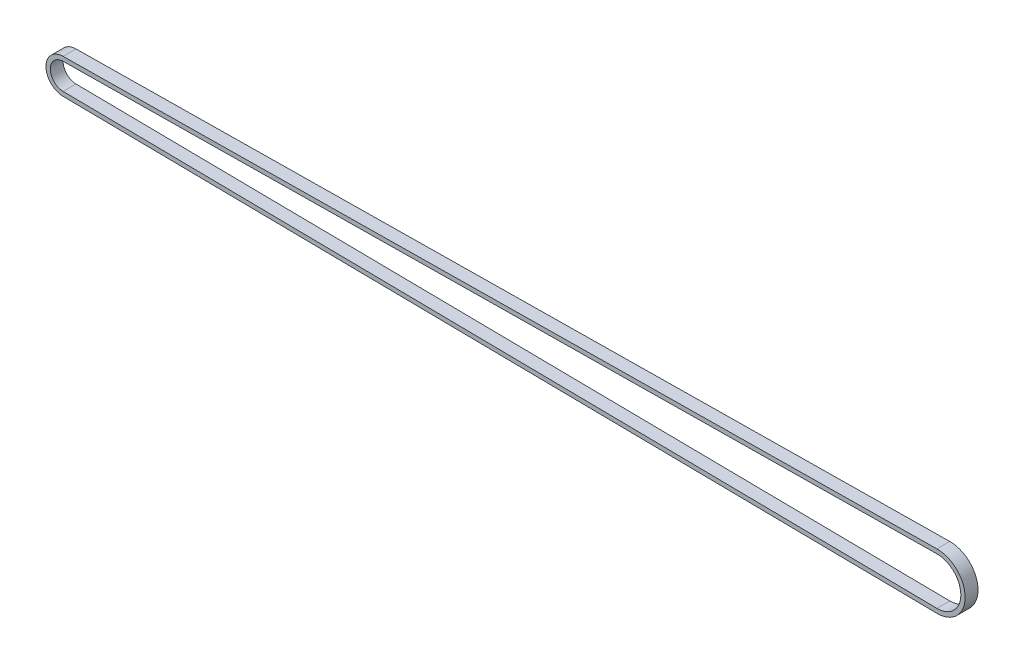
ISO-10303-21;
HEADER;
FILE_DESCRIPTION(('STEP AP214'),'2;1');
FILE_NAME('part.step','',(''),(''),'','','');
FILE_SCHEMA(('AUTOMOTIVE_DESIGN { 1 0 10303 214 1 1 1 1 }'));
ENDSEC;
DATA;
#1=APPLICATION_CONTEXT('core data for automotive mechanical design processes');
#2=APPLICATION_PROTOCOL_DEFINITION('international standard','automotive_design',2000,#1);
#3=PRODUCT_CONTEXT('',#1,'mechanical');
#4=PRODUCT('Part','Part','',(#3));
#5=PRODUCT_RELATED_PRODUCT_CATEGORY('part','',(#4));
#6=PRODUCT_DEFINITION_FORMATION('','',#4);
#7=PRODUCT_DEFINITION_CONTEXT('part definition',#1,'design');
#8=PRODUCT_DEFINITION('design','',#6,#7);
#9=PRODUCT_DEFINITION_SHAPE('','',#8);
#10=(LENGTH_UNIT() NAMED_UNIT(*) SI_UNIT(.MILLI.,.METRE.));
#11=(NAMED_UNIT(*) PLANE_ANGLE_UNIT() SI_UNIT($,.RADIAN.));
#12=(NAMED_UNIT(*) SI_UNIT($,.STERADIAN.) SOLID_ANGLE_UNIT());
#13=UNCERTAINTY_MEASURE_WITH_UNIT(LENGTH_MEASURE(1.E-05),#10,'distance_accuracy_value','');
#14=(GEOMETRIC_REPRESENTATION_CONTEXT(3) GLOBAL_UNCERTAINTY_ASSIGNED_CONTEXT((#13)) GLOBAL_UNIT_ASSIGNED_CONTEXT((#10,
#11,#12)) REPRESENTATION_CONTEXT('',''));
#15=CARTESIAN_POINT('',(0.,0.,0.));
#16=DIRECTION('',(0.,0.,1.));
#17=DIRECTION('',(1.,0.,0.));
#18=AXIS2_PLACEMENT_3D('',#15,#16,#17);
#19=CARTESIAN_POINT('',(407.022461389432,-0.106259451570986,3.));
#20=DIRECTION('',(0.,0.,-1.));
#21=DIRECTION('',(-1.,0.,0.));
#22=AXIS2_PLACEMENT_3D('',#19,#20,#21);
#23=PLANE('',#22);
#24=CARTESIAN_POINT('',(407.022461389432,-0.106259451570986,3.));
#25=DIRECTION('',(0.,0.,-1.));
#26=DIRECTION('',(-1.,0.,0.));
#27=AXIS2_PLACEMENT_3D('',#24,#25,#26);
#28=CIRCLE('',#27,13.);
#29=CARTESIAN_POINT('',(406.861607202422,-13.1052642569598,3.));
#30=VERTEX_POINT('',#29);
#31=CARTESIAN_POINT('',(406.86839440274,12.8928275688167,3.));
#32=VERTEX_POINT('',#31);
#33=EDGE_CURVE('E160',#30,#32,#28,.F.);
#34=ORIENTED_EDGE('',*,*,#33,.T.);
#35=DIRECTION('',(-0.999929770799053,-0.0118513066686266,0.));
#36=VECTOR('',#35,1.);
#37=CARTESIAN_POINT('',(406.86839440274,12.8928275688167,3.));
#38=LINE('',#37,#36);
#39=CARTESIAN_POINT('',(-0.0956400448158724,8.06943325034834,3.));
#40=VERTEX_POINT('',#39);
#41=EDGE_CURVE('E163',#32,#40,#38,.T.);
#42=ORIENTED_EDGE('',*,*,#41,.T.);
#43=CARTESIAN_POINT('',(0.,0.,3.));
#44=DIRECTION('',(0.,0.,-1.));
#45=DIRECTION('',(-1.,0.,0.));
#46=AXIS2_PLACEMENT_3D('',#43,#44,#45);
#47=CIRCLE('',#46,8.07);
#48=CARTESIAN_POINT('',(-0.0998533299362394,-8.06938221380676,3.));
#49=VERTEX_POINT('',#48);
#50=EDGE_CURVE('E166',#40,#49,#47,.F.);
#51=ORIENTED_EDGE('',*,*,#50,.T.);
#52=DIRECTION('',(0.99992344656837,-0.012373399000766,0.));
#53=VECTOR('',#52,1.);
#54=CARTESIAN_POINT('',(406.861607202422,-13.1052642569598,3.));
#55=LINE('',#54,#53);
#56=EDGE_CURVE('E168',#49,#30,#55,.T.);
#57=ORIENTED_EDGE('',*,*,#56,.T.);
#58=EDGE_LOOP('',(#34,#42,#51,#57));
#59=FACE_BOUND('',#58,.T.);
#60=CARTESIAN_POINT('',(407.022461389432,-0.106259451570986,3.));
#61=DIRECTION('',(0.,0.,-1.));
#62=DIRECTION('',(-1.,0.,0.));
#63=AXIS2_PLACEMENT_3D('',#60,#61,#62);
#64=CIRCLE('',#63,11.);
#65=CARTESIAN_POINT('',(406.886354000424,-11.1054173638231,3.));
#66=VERTEX_POINT('',#65);
#67=CARTESIAN_POINT('',(406.892097016077,10.8929680272186,3.));
#68=VERTEX_POINT('',#67);
#69=EDGE_CURVE('E124',#66,#68,#64,.F.);
#70=ORIENTED_EDGE('',*,*,#69,.F.);
#71=DIRECTION('',(0.99992344656837,-0.012373399000766,0.));
#72=VECTOR('',#71,1.);
#73=CARTESIAN_POINT('',(406.886354000424,-11.1054173638231,3.));
#74=LINE('',#73,#72);
#75=CARTESIAN_POINT('',(-0.0751065319346544,-6.06953532067002,3.));
#76=VERTEX_POINT('',#75);
#77=EDGE_CURVE('E146',#76,#66,#74,.T.);
#78=ORIENTED_EDGE('',*,*,#77,.F.);
#79=CARTESIAN_POINT('',(0.,0.,3.));
#80=DIRECTION('',(0.,0.,-1.));
#81=DIRECTION('',(-1.,0.,0.));
#82=AXIS2_PLACEMENT_3D('',#79,#80,#81);
#83=CIRCLE('',#82,6.07);
#84=CARTESIAN_POINT('',(-0.0719374314786192,6.06957370875024,3.));
#85=VERTEX_POINT('',#84);
#86=EDGE_CURVE('E144',#85,#76,#83,.F.);
#87=ORIENTED_EDGE('',*,*,#86,.F.);
#88=DIRECTION('',(-0.999929770799053,-0.0118513066686266,0.));
#89=VECTOR('',#88,1.);
#90=CARTESIAN_POINT('',(406.892097016077,10.8929680272186,3.));
#91=LINE('',#90,#89);
#92=EDGE_CURVE('E132',#68,#85,#91,.T.);
#93=ORIENTED_EDGE('',*,*,#92,.F.);
#94=EDGE_LOOP('',(#70,#78,#87,#93));
#95=FACE_BOUND('',#94,.T.);
#96=ADVANCED_FACE('F59',(#59,#95),#23,.F.);
#97=CARTESIAN_POINT('',(407.022461389432,-0.106259451570986,-3.));
#98=DIRECTION('',(0.,0.,-1.));
#99=DIRECTION('',(-1.,0.,0.));
#100=AXIS2_PLACEMENT_3D('',#97,#98,#99);
#101=PLANE('',#100);
#102=CARTESIAN_POINT('',(407.022461389432,-0.106259451570986,-3.));
#103=DIRECTION('',(0.,0.,-1.));
#104=DIRECTION('',(-1.,0.,0.));
#105=AXIS2_PLACEMENT_3D('',#102,#103,#104);
#106=CIRCLE('',#105,13.);
#107=CARTESIAN_POINT('',(406.861607202422,-13.1052642569598,-3.));
#108=VERTEX_POINT('',#107);
#109=CARTESIAN_POINT('',(406.86839440274,12.8928275688167,-3.));
#110=VERTEX_POINT('',#109);
#111=EDGE_CURVE('E140',#108,#110,#106,.F.);
#112=ORIENTED_EDGE('',*,*,#111,.F.);
#113=DIRECTION('',(0.99992344656837,-0.012373399000766,0.));
#114=VECTOR('',#113,1.);
#115=CARTESIAN_POINT('',(406.861607202422,-13.1052642569598,-3.));
#116=LINE('',#115,#114);
#117=CARTESIAN_POINT('',(-0.0998533299362394,-8.06938221380676,-3.));
#118=VERTEX_POINT('',#117);
#119=EDGE_CURVE('E164',#118,#108,#116,.T.);
#120=ORIENTED_EDGE('',*,*,#119,.F.);
#121=CARTESIAN_POINT('',(0.,0.,-3.));
#122=DIRECTION('',(0.,0.,-1.));
#123=DIRECTION('',(-1.,0.,0.));
#124=AXIS2_PLACEMENT_3D('',#121,#122,#123);
#125=CIRCLE('',#124,8.07);
#126=CARTESIAN_POINT('',(-0.0956400448158724,8.06943325034834,-3.));
#127=VERTEX_POINT('',#126);
#128=EDGE_CURVE('E175',#127,#118,#125,.F.);
#129=ORIENTED_EDGE('',*,*,#128,.F.);
#130=DIRECTION('',(-0.999929770799053,-0.0118513066686266,0.));
#131=VECTOR('',#130,1.);
#132=CARTESIAN_POINT('',(406.86839440274,12.8928275688167,-3.));
#133=LINE('',#132,#131);
#134=EDGE_CURVE('E173',#110,#127,#133,.T.);
#135=ORIENTED_EDGE('',*,*,#134,.F.);
#136=EDGE_LOOP('',(#112,#120,#129,#135));
#137=FACE_BOUND('',#136,.T.);
#138=DIRECTION('',(0.99992344656837,-0.012373399000766,0.));
#139=VECTOR('',#138,1.);
#140=CARTESIAN_POINT('',(406.886354000424,-11.1054173638231,-3.));
#141=LINE('',#140,#139);
#142=CARTESIAN_POINT('',(-0.0751065319347069,-6.06953532067002,-3.));
#143=VERTEX_POINT('',#142);
#144=CARTESIAN_POINT('',(406.886354000424,-11.1054173638231,-3.));
#145=VERTEX_POINT('',#144);
#146=EDGE_CURVE('E133',#143,#145,#141,.T.);
#147=ORIENTED_EDGE('',*,*,#146,.T.);
#148=CARTESIAN_POINT('',(407.022461389432,-0.106259451570986,-3.));
#149=DIRECTION('',(0.,0.,-1.));
#150=DIRECTION('',(-1.,0.,0.));
#151=AXIS2_PLACEMENT_3D('',#148,#149,#150);
#152=CIRCLE('',#151,11.);
#153=CARTESIAN_POINT('',(406.892097016077,10.8929680272186,-3.));
#154=VERTEX_POINT('',#153);
#155=EDGE_CURVE('E82',#145,#154,#152,.F.);
#156=ORIENTED_EDGE('',*,*,#155,.T.);
#157=DIRECTION('',(-0.999929770799053,-0.0118513066686266,0.));
#158=VECTOR('',#157,1.);
#159=CARTESIAN_POINT('',(406.892097016077,10.8929680272186,-3.));
#160=LINE('',#159,#158);
#161=CARTESIAN_POINT('',(-0.0719374314786192,6.06957370875024,-3.));
#162=VERTEX_POINT('',#161);
#163=EDGE_CURVE('E139',#154,#162,#160,.T.);
#164=ORIENTED_EDGE('',*,*,#163,.T.);
#165=CARTESIAN_POINT('',(0.,0.,-3.));
#166=DIRECTION('',(0.,0.,-1.));
#167=DIRECTION('',(-1.,0.,0.));
#168=AXIS2_PLACEMENT_3D('',#165,#166,#167);
#169=CIRCLE('',#168,6.07);
#170=EDGE_CURVE('E152',#162,#143,#169,.F.);
#171=ORIENTED_EDGE('',*,*,#170,.T.);
#172=EDGE_LOOP('',(#147,#156,#164,#171));
#173=FACE_BOUND('',#172,.T.);
#174=ADVANCED_FACE('F193',(#137,#173),#101,.T.);
#175=CARTESIAN_POINT('',(407.022461389432,-0.106259451570986,3.));
#176=DIRECTION('',(0.,0.,-1.));
#177=DIRECTION('',(-1.,0.,0.));
#178=AXIS2_PLACEMENT_3D('',#175,#176,#177);
#179=CYLINDRICAL_SURFACE('',#178,13.);
#180=ORIENTED_EDGE('',*,*,#111,.T.);
#181=DIRECTION('',(0.,0.,-1.));
#182=VECTOR('',#181,1.);
#183=CARTESIAN_POINT('',(406.86839440274,12.8928275688167,3.));
#184=LINE('',#183,#182);
#185=EDGE_CURVE('E12',#32,#110,#184,.T.);
#186=ORIENTED_EDGE('',*,*,#185,.F.);
#187=ORIENTED_EDGE('',*,*,#33,.F.);
#188=DIRECTION('',(0.,0.,-1.));
#189=VECTOR('',#188,1.);
#190=CARTESIAN_POINT('',(406.861607202422,-13.1052642569598,3.));
#191=LINE('',#190,#189);
#192=EDGE_CURVE('E170',#30,#108,#191,.T.);
#193=ORIENTED_EDGE('',*,*,#192,.T.);
#194=EDGE_LOOP('',(#180,#186,#187,#193));
#195=FACE_BOUND('',#194,.T.);
#196=ADVANCED_FACE('F61',(#195),#179,.T.);
#197=CARTESIAN_POINT('',(406.86839440274,12.8928275688167,3.));
#198=DIRECTION('',(0.0118513066686266,-0.999929770799053,0.));
#199=DIRECTION('',(0.999929770799053,0.0118513066686266,0.));
#200=AXIS2_PLACEMENT_3D('',#197,#198,#199);
#201=PLANE('',#200);
#202=ORIENTED_EDGE('',*,*,#134,.T.);
#203=DIRECTION('',(0.,0.,-1.));
#204=VECTOR('',#203,1.);
#205=CARTESIAN_POINT('',(-0.0956400448158724,8.06943325034834,3.));
#206=LINE('',#205,#204);
#207=EDGE_CURVE('E67',#40,#127,#206,.T.);
#208=ORIENTED_EDGE('',*,*,#207,.F.);
#209=ORIENTED_EDGE('',*,*,#41,.F.);
#210=ORIENTED_EDGE('',*,*,#185,.T.);
#211=EDGE_LOOP('',(#202,#208,#209,#210));
#212=FACE_BOUND('',#211,.T.);
#213=ADVANCED_FACE('F203',(#212),#201,.F.);
#214=CARTESIAN_POINT('',(0.,0.,3.));
#215=DIRECTION('',(0.,0.,-1.));
#216=DIRECTION('',(-1.,0.,0.));
#217=AXIS2_PLACEMENT_3D('',#214,#215,#216);
#218=CYLINDRICAL_SURFACE('',#217,8.07);
#219=ORIENTED_EDGE('',*,*,#128,.T.);
#220=DIRECTION('',(0.,0.,-1.));
#221=VECTOR('',#220,1.);
#222=CARTESIAN_POINT('',(-0.0998533299362394,-8.06938221380676,3.));
#223=LINE('',#222,#221);
#224=EDGE_CURVE('E180',#49,#118,#223,.T.);
#225=ORIENTED_EDGE('',*,*,#224,.F.);
#226=ORIENTED_EDGE('',*,*,#50,.F.);
#227=ORIENTED_EDGE('',*,*,#207,.T.);
#228=EDGE_LOOP('',(#219,#225,#226,#227));
#229=FACE_BOUND('',#228,.T.);
#230=ADVANCED_FACE('F187',(#229),#218,.T.);
#231=CARTESIAN_POINT('',(406.861607202422,-13.1052642569598,3.));
#232=DIRECTION('',(0.012373399000766,0.99992344656837,0.));
#233=DIRECTION('',(-0.99992344656837,0.012373399000766,0.));
#234=AXIS2_PLACEMENT_3D('',#231,#232,#233);
#235=PLANE('',#234);
#236=ORIENTED_EDGE('',*,*,#119,.T.);
#237=ORIENTED_EDGE('',*,*,#192,.F.);
#238=ORIENTED_EDGE('',*,*,#56,.F.);
#239=ORIENTED_EDGE('',*,*,#224,.T.);
#240=EDGE_LOOP('',(#236,#237,#238,#239));
#241=FACE_BOUND('',#240,.T.);
#242=ADVANCED_FACE('F197',(#241),#235,.F.);
#243=CARTESIAN_POINT('',(407.022461389432,-0.106259451570986,3.));
#244=DIRECTION('',(0.,0.,-1.));
#245=DIRECTION('',(-1.,0.,0.));
#246=AXIS2_PLACEMENT_3D('',#243,#244,#245);
#247=CYLINDRICAL_SURFACE('',#246,11.);
#248=ORIENTED_EDGE('',*,*,#155,.F.);
#249=DIRECTION('',(0.,0.,-1.));
#250=VECTOR('',#249,1.);
#251=CARTESIAN_POINT('',(406.886354000424,-11.1054173638231,3.));
#252=LINE('',#251,#250);
#253=EDGE_CURVE('E128',#66,#145,#252,.T.);
#254=ORIENTED_EDGE('',*,*,#253,.F.);
#255=ORIENTED_EDGE('',*,*,#69,.T.);
#256=DIRECTION('',(0.,0.,-1.));
#257=VECTOR('',#256,1.);
#258=CARTESIAN_POINT('',(406.892097016077,10.8929680272186,3.));
#259=LINE('',#258,#257);
#260=EDGE_CURVE('E127',#68,#154,#259,.T.);
#261=ORIENTED_EDGE('',*,*,#260,.T.);
#262=EDGE_LOOP('',(#248,#254,#255,#261));
#263=FACE_BOUND('',#262,.T.);
#264=ADVANCED_FACE('F126',(#263),#247,.F.);
#265=CARTESIAN_POINT('',(406.892097016077,10.8929680272186,3.));
#266=DIRECTION('',(0.0118513066686266,-0.999929770799053,0.));
#267=DIRECTION('',(0.999929770799053,0.0118513066686266,0.));
#268=AXIS2_PLACEMENT_3D('',#265,#266,#267);
#269=PLANE('',#268);
#270=ORIENTED_EDGE('',*,*,#163,.F.);
#271=ORIENTED_EDGE('',*,*,#260,.F.);
#272=ORIENTED_EDGE('',*,*,#92,.T.);
#273=DIRECTION('',(0.,0.,-1.));
#274=VECTOR('',#273,1.);
#275=CARTESIAN_POINT('',(-0.0719374314786192,6.06957370875024,3.));
#276=LINE('',#275,#274);
#277=EDGE_CURVE('E141',#85,#162,#276,.T.);
#278=ORIENTED_EDGE('',*,*,#277,.T.);
#279=EDGE_LOOP('',(#270,#271,#272,#278));
#280=FACE_BOUND('',#279,.T.);
#281=ADVANCED_FACE('F136',(#280),#269,.T.);
#282=CARTESIAN_POINT('',(0.,0.,3.));
#283=DIRECTION('',(0.,0.,-1.));
#284=DIRECTION('',(-1.,0.,0.));
#285=AXIS2_PLACEMENT_3D('',#282,#283,#284);
#286=CYLINDRICAL_SURFACE('',#285,6.07);
#287=ORIENTED_EDGE('',*,*,#170,.F.);
#288=ORIENTED_EDGE('',*,*,#277,.F.);
#289=ORIENTED_EDGE('',*,*,#86,.T.);
#290=DIRECTION('',(0.,0.,-1.));
#291=VECTOR('',#290,1.);
#292=CARTESIAN_POINT('',(-0.0751065319347069,-6.06953532067002,3.));
#293=LINE('',#292,#291);
#294=EDGE_CURVE('E74',#76,#143,#293,.T.);
#295=ORIENTED_EDGE('',*,*,#294,.T.);
#296=EDGE_LOOP('',(#287,#288,#289,#295));
#297=FACE_BOUND('',#296,.T.);
#298=ADVANCED_FACE('F226',(#297),#286,.F.);
#299=CARTESIAN_POINT('',(406.886354000424,-11.1054173638231,3.));
#300=DIRECTION('',(0.012373399000766,0.99992344656837,0.));
#301=DIRECTION('',(-0.99992344656837,0.012373399000766,0.));
#302=AXIS2_PLACEMENT_3D('',#299,#300,#301);
#303=PLANE('',#302);
#304=ORIENTED_EDGE('',*,*,#146,.F.);
#305=ORIENTED_EDGE('',*,*,#294,.F.);
#306=ORIENTED_EDGE('',*,*,#77,.T.);
#307=ORIENTED_EDGE('',*,*,#253,.T.);
#308=EDGE_LOOP('',(#304,#305,#306,#307));
#309=FACE_BOUND('',#308,.T.);
#310=ADVANCED_FACE('F230',(#309),#303,.T.);
#311=CLOSED_SHELL('',(#96,#174,#196,#213,#230,#242,#264,#281,#298,#310));
#312=MANIFOLD_SOLID_BREP('B2',#311);
#313=ADVANCED_BREP_SHAPE_REPRESENTATION('',(#18,#312),#14);
#314=SHAPE_DEFINITION_REPRESENTATION(#9,#313);
ENDSEC;
END-ISO-10303-21;
